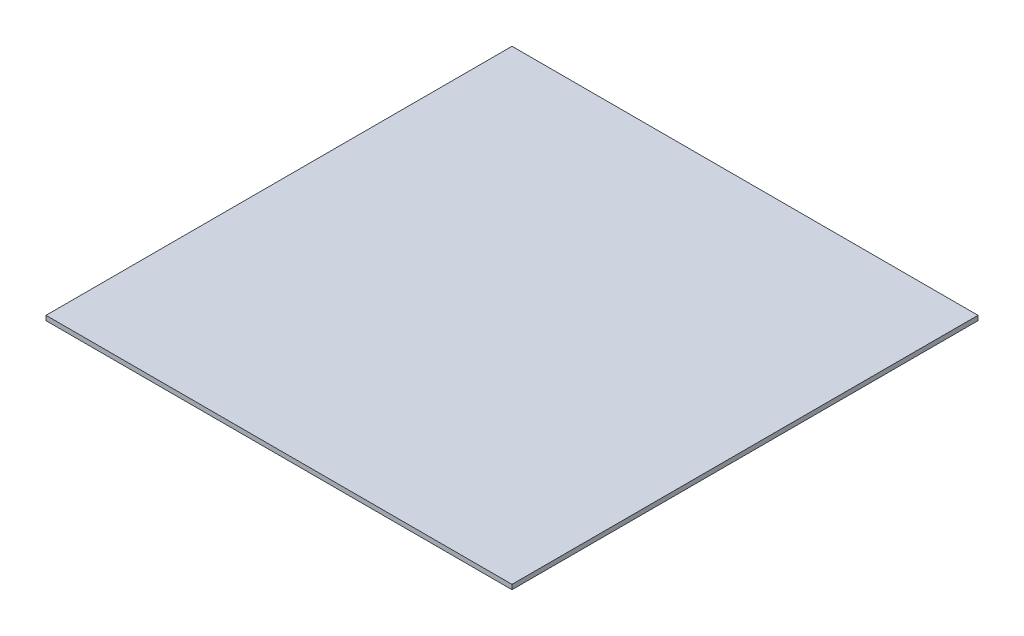
ISO-10303-21;
HEADER;
FILE_DESCRIPTION(('STEP AP214'),'2;1');
FILE_NAME('part.step','',(''),(''),'','','');
FILE_SCHEMA(('AUTOMOTIVE_DESIGN { 1 0 10303 214 1 1 1 1 }'));
ENDSEC;
DATA;
#1=APPLICATION_CONTEXT('core data for automotive mechanical design processes');
#2=APPLICATION_PROTOCOL_DEFINITION('international standard','automotive_design',2000,#1);
#3=PRODUCT_CONTEXT('',#1,'mechanical');
#4=PRODUCT('Part','Part','',(#3));
#5=PRODUCT_RELATED_PRODUCT_CATEGORY('part','',(#4));
#6=PRODUCT_DEFINITION_FORMATION('','',#4);
#7=PRODUCT_DEFINITION_CONTEXT('part definition',#1,'design');
#8=PRODUCT_DEFINITION('design','',#6,#7);
#9=PRODUCT_DEFINITION_SHAPE('','',#8);
#10=(LENGTH_UNIT() NAMED_UNIT(*) SI_UNIT(.MILLI.,.METRE.));
#11=(NAMED_UNIT(*) PLANE_ANGLE_UNIT() SI_UNIT($,.RADIAN.));
#12=(NAMED_UNIT(*) SI_UNIT($,.STERADIAN.) SOLID_ANGLE_UNIT());
#13=UNCERTAINTY_MEASURE_WITH_UNIT(LENGTH_MEASURE(1.E-05),#10,'distance_accuracy_value','');
#14=(GEOMETRIC_REPRESENTATION_CONTEXT(3) GLOBAL_UNCERTAINTY_ASSIGNED_CONTEXT((#13)) GLOBAL_UNIT_ASSIGNED_CONTEXT((#10,
#11,#12)) REPRESENTATION_CONTEXT('',''));
#15=CARTESIAN_POINT('',(0.,0.,0.));
#16=DIRECTION('',(0.,0.,1.));
#17=DIRECTION('',(1.,0.,0.));
#18=AXIS2_PLACEMENT_3D('',#15,#16,#17);
#19=CARTESIAN_POINT('',(125.,1.25,125.));
#20=DIRECTION('',(-1.,0.,0.));
#21=DIRECTION('',(0.,0.,1.));
#22=AXIS2_PLACEMENT_3D('',#19,#20,#21);
#23=PLANE('',#22);
#24=DIRECTION('',(0.,0.,-1.));
#25=VECTOR('',#24,1.);
#26=CARTESIAN_POINT('',(125.,-1.25,125.));
#27=LINE('',#26,#25);
#28=CARTESIAN_POINT('',(125.,-1.25,125.));
#29=VERTEX_POINT('',#28);
#30=CARTESIAN_POINT('',(125.,-1.25,-125.));
#31=VERTEX_POINT('',#30);
#32=EDGE_CURVE('E99',#29,#31,#27,.T.);
#33=ORIENTED_EDGE('',*,*,#32,.T.);
#34=DIRECTION('',(0.,-1.,0.));
#35=VECTOR('',#34,1.);
#36=CARTESIAN_POINT('',(125.,1.25,-125.));
#37=LINE('',#36,#35);
#38=CARTESIAN_POINT('',(125.,1.25,-125.));
#39=VERTEX_POINT('',#38);
#40=EDGE_CURVE('E11',#39,#31,#37,.T.);
#41=ORIENTED_EDGE('',*,*,#40,.F.);
#42=DIRECTION('',(0.,0.,-1.));
#43=VECTOR('',#42,1.);
#44=CARTESIAN_POINT('',(125.,1.25,125.));
#45=LINE('',#44,#43);
#46=CARTESIAN_POINT('',(125.,1.25,125.));
#47=VERTEX_POINT('',#46);
#48=EDGE_CURVE('E87',#47,#39,#45,.T.);
#49=ORIENTED_EDGE('',*,*,#48,.F.);
#50=DIRECTION('',(0.,-1.,0.));
#51=VECTOR('',#50,1.);
#52=CARTESIAN_POINT('',(125.,1.25,125.));
#53=LINE('',#52,#51);
#54=EDGE_CURVE('E95',#47,#29,#53,.T.);
#55=ORIENTED_EDGE('',*,*,#54,.T.);
#56=EDGE_LOOP('',(#33,#41,#49,#55));
#57=FACE_BOUND('',#56,.T.);
#58=ADVANCED_FACE('F36',(#57),#23,.F.);
#59=CARTESIAN_POINT('',(-125.,1.25,-125.));
#60=DIRECTION('',(0.,0.,1.));
#61=DIRECTION('',(1.,0.,0.));
#62=AXIS2_PLACEMENT_3D('',#59,#60,#61);
#63=PLANE('',#62);
#64=DIRECTION('',(-1.,0.,0.));
#65=VECTOR('',#64,1.);
#66=CARTESIAN_POINT('',(-125.,-1.25,-125.));
#67=LINE('',#66,#65);
#68=CARTESIAN_POINT('',(-125.,-1.25,-125.));
#69=VERTEX_POINT('',#68);
#70=EDGE_CURVE('E91',#31,#69,#67,.T.);
#71=ORIENTED_EDGE('',*,*,#70,.T.);
#72=DIRECTION('',(0.,-1.,0.));
#73=VECTOR('',#72,1.);
#74=CARTESIAN_POINT('',(-125.,1.25,-125.));
#75=LINE('',#74,#73);
#76=CARTESIAN_POINT('',(-125.,1.25,-125.));
#77=VERTEX_POINT('',#76);
#78=EDGE_CURVE('E44',#77,#69,#75,.T.);
#79=ORIENTED_EDGE('',*,*,#78,.F.);
#80=DIRECTION('',(-1.,0.,0.));
#81=VECTOR('',#80,1.);
#82=CARTESIAN_POINT('',(-125.,1.25,-125.));
#83=LINE('',#82,#81);
#84=EDGE_CURVE('E82',#39,#77,#83,.T.);
#85=ORIENTED_EDGE('',*,*,#84,.F.);
#86=ORIENTED_EDGE('',*,*,#40,.T.);
#87=EDGE_LOOP('',(#71,#79,#85,#86));
#88=FACE_BOUND('',#87,.T.);
#89=ADVANCED_FACE('F90',(#88),#63,.F.);
#90=CARTESIAN_POINT('',(-125.,1.25,125.));
#91=DIRECTION('',(1.,0.,0.));
#92=DIRECTION('',(0.,0.,-1.));
#93=AXIS2_PLACEMENT_3D('',#90,#91,#92);
#94=PLANE('',#93);
#95=DIRECTION('',(0.,0.,1.));
#96=VECTOR('',#95,1.);
#97=CARTESIAN_POINT('',(-125.,-1.25,125.));
#98=LINE('',#97,#96);
#99=CARTESIAN_POINT('',(-125.,-1.25,125.));
#100=VERTEX_POINT('',#99);
#101=EDGE_CURVE('E69',#69,#100,#98,.T.);
#102=ORIENTED_EDGE('',*,*,#101,.T.);
#103=DIRECTION('',(0.,-1.,0.));
#104=VECTOR('',#103,1.);
#105=CARTESIAN_POINT('',(-125.,1.25,125.));
#106=LINE('',#105,#104);
#107=CARTESIAN_POINT('',(-125.,1.25,125.));
#108=VERTEX_POINT('',#107);
#109=EDGE_CURVE('E92',#108,#100,#106,.T.);
#110=ORIENTED_EDGE('',*,*,#109,.F.);
#111=DIRECTION('',(0.,0.,1.));
#112=VECTOR('',#111,1.);
#113=CARTESIAN_POINT('',(-125.,1.25,125.));
#114=LINE('',#113,#112);
#115=EDGE_CURVE('E85',#77,#108,#114,.T.);
#116=ORIENTED_EDGE('',*,*,#115,.F.);
#117=ORIENTED_EDGE('',*,*,#78,.T.);
#118=EDGE_LOOP('',(#102,#110,#116,#117));
#119=FACE_BOUND('',#118,.T.);
#120=ADVANCED_FACE('F93',(#119),#94,.F.);
#121=CARTESIAN_POINT('',(-125.,1.25,125.));
#122=DIRECTION('',(0.,0.,-1.));
#123=DIRECTION('',(-1.,0.,0.));
#124=AXIS2_PLACEMENT_3D('',#121,#122,#123);
#125=PLANE('',#124);
#126=DIRECTION('',(1.,0.,0.));
#127=VECTOR('',#126,1.);
#128=CARTESIAN_POINT('',(-125.,-1.25,125.));
#129=LINE('',#128,#127);
#130=EDGE_CURVE('E75',#100,#29,#129,.T.);
#131=ORIENTED_EDGE('',*,*,#130,.T.);
#132=ORIENTED_EDGE('',*,*,#54,.F.);
#133=DIRECTION('',(1.,0.,0.));
#134=VECTOR('',#133,1.);
#135=CARTESIAN_POINT('',(-125.,1.25,125.));
#136=LINE('',#135,#134);
#137=EDGE_CURVE('E52',#108,#47,#136,.T.);
#138=ORIENTED_EDGE('',*,*,#137,.F.);
#139=ORIENTED_EDGE('',*,*,#109,.T.);
#140=EDGE_LOOP('',(#131,#132,#138,#139));
#141=FACE_BOUND('',#140,.T.);
#142=ADVANCED_FACE('F106',(#141),#125,.F.);
#143=CARTESIAN_POINT('',(0.,1.25,0.));
#144=DIRECTION('',(0.,-1.,0.));
#145=DIRECTION('',(0.,0.,-1.));
#146=AXIS2_PLACEMENT_3D('',#143,#144,#145);
#147=PLANE('',#146);
#148=ORIENTED_EDGE('',*,*,#48,.T.);
#149=ORIENTED_EDGE('',*,*,#84,.T.);
#150=ORIENTED_EDGE('',*,*,#115,.T.);
#151=ORIENTED_EDGE('',*,*,#137,.T.);
#152=EDGE_LOOP('',(#148,#149,#150,#151));
#153=FACE_BOUND('',#152,.T.);
#154=ADVANCED_FACE('F83',(#153),#147,.F.);
#155=CARTESIAN_POINT('',(0.,-1.25,0.));
#156=DIRECTION('',(0.,-1.,0.));
#157=DIRECTION('',(0.,0.,-1.));
#158=AXIS2_PLACEMENT_3D('',#155,#156,#157);
#159=PLANE('',#158);
#160=ORIENTED_EDGE('',*,*,#32,.F.);
#161=ORIENTED_EDGE('',*,*,#130,.F.);
#162=ORIENTED_EDGE('',*,*,#101,.F.);
#163=ORIENTED_EDGE('',*,*,#70,.F.);
#164=EDGE_LOOP('',(#160,#161,#162,#163));
#165=FACE_BOUND('',#164,.T.);
#166=ADVANCED_FACE('F109',(#165),#159,.T.);
#167=CLOSED_SHELL('',(#58,#89,#120,#142,#154,#166));
#168=MANIFOLD_SOLID_BREP('B2',#167);
#169=ADVANCED_BREP_SHAPE_REPRESENTATION('',(#18,#168),#14);
#170=SHAPE_DEFINITION_REPRESENTATION(#9,#169);
ENDSEC;
END-ISO-10303-21;
